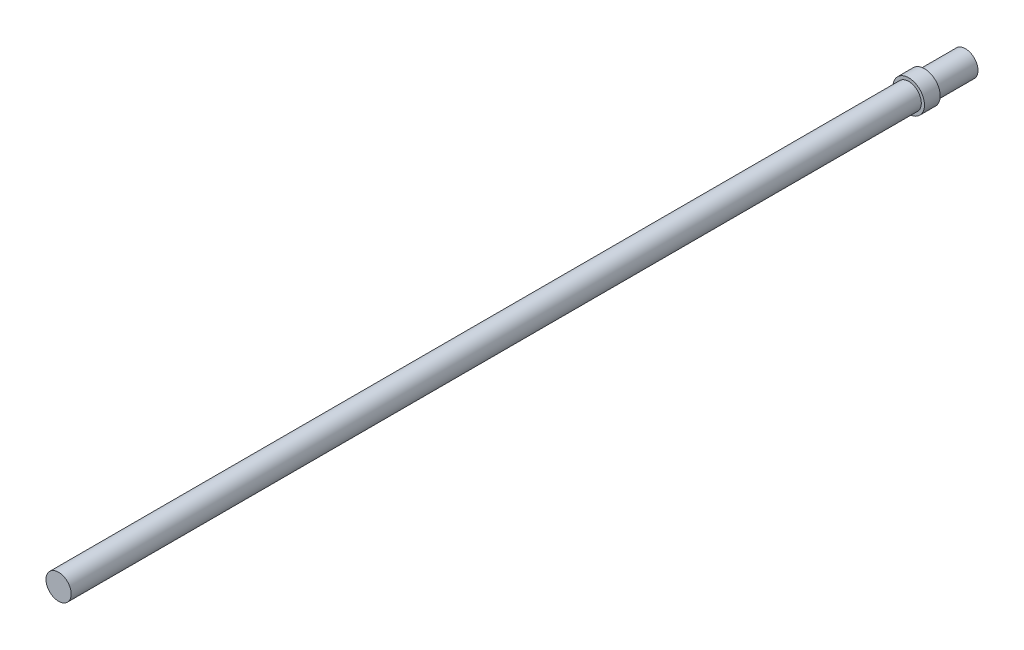
ISO-10303-21;
HEADER;
FILE_DESCRIPTION(('STEP AP214'),'2;1');
FILE_NAME('part.step','',(''),(''),'','','');
FILE_SCHEMA(('AUTOMOTIVE_DESIGN { 1 0 10303 214 1 1 1 1 }'));
ENDSEC;
DATA;
#1=APPLICATION_CONTEXT('core data for automotive mechanical design processes');
#2=APPLICATION_PROTOCOL_DEFINITION('international standard','automotive_design',2000,#1);
#3=PRODUCT_CONTEXT('',#1,'mechanical');
#4=PRODUCT('Part','Part','',(#3));
#5=PRODUCT_RELATED_PRODUCT_CATEGORY('part','',(#4));
#6=PRODUCT_DEFINITION_FORMATION('','',#4);
#7=PRODUCT_DEFINITION_CONTEXT('part definition',#1,'design');
#8=PRODUCT_DEFINITION('design','',#6,#7);
#9=PRODUCT_DEFINITION_SHAPE('','',#8);
#10=(LENGTH_UNIT() NAMED_UNIT(*) SI_UNIT(.MILLI.,.METRE.));
#11=(NAMED_UNIT(*) PLANE_ANGLE_UNIT() SI_UNIT($,.RADIAN.));
#12=(NAMED_UNIT(*) SI_UNIT($,.STERADIAN.) SOLID_ANGLE_UNIT());
#13=UNCERTAINTY_MEASURE_WITH_UNIT(LENGTH_MEASURE(1.E-05),#10,'distance_accuracy_value','');
#14=(GEOMETRIC_REPRESENTATION_CONTEXT(3) GLOBAL_UNCERTAINTY_ASSIGNED_CONTEXT((#13)) GLOBAL_UNIT_ASSIGNED_CONTEXT((#10,
#11,#12)) REPRESENTATION_CONTEXT('',''));
#15=CARTESIAN_POINT('',(0.,0.,0.));
#16=DIRECTION('',(0.,0.,1.));
#17=DIRECTION('',(1.,0.,0.));
#18=AXIS2_PLACEMENT_3D('',#15,#16,#17);
#19=CARTESIAN_POINT('',(0.,0.,270.));
#20=DIRECTION('',(0.,0.,-1.));
#21=DIRECTION('',(-1.,0.,0.));
#22=AXIS2_PLACEMENT_3D('',#19,#20,#21);
#23=CYLINDRICAL_SURFACE('',#22,4.);
#24=CARTESIAN_POINT('',(0.,0.,270.));
#25=DIRECTION('',(0.,0.,1.));
#26=DIRECTION('',(1.,0.,0.));
#27=AXIS2_PLACEMENT_3D('',#24,#25,#26);
#28=CIRCLE('',#27,4.);
#29=CARTESIAN_POINT('',(4.,0.,270.));
#30=VERTEX_POINT('',#29);
#31=EDGE_CURVE('E10',#30,#30,#28,.T.);
#32=ORIENTED_EDGE('',*,*,#31,.F.);
#33=EDGE_LOOP('',(#32));
#34=FACE_BOUND('',#33,.T.);
#35=CARTESIAN_POINT('',(0.,0.,0.));
#36=DIRECTION('',(0.,0.,1.));
#37=DIRECTION('',(1.,0.,0.));
#38=AXIS2_PLACEMENT_3D('',#35,#36,#37);
#39=CIRCLE('',#38,4.);
#40=CARTESIAN_POINT('',(4.,0.,0.));
#41=VERTEX_POINT('',#40);
#42=EDGE_CURVE('E37',#41,#41,#39,.T.);
#43=ORIENTED_EDGE('',*,*,#42,.T.);
#44=EDGE_LOOP('',(#43));
#45=FACE_BOUND('',#44,.T.);
#46=ADVANCED_FACE('F31',(#34,#45),#23,.T.);
#47=CARTESIAN_POINT('',(0.,0.,270.));
#48=DIRECTION('',(0.,0.,1.));
#49=DIRECTION('',(1.,0.,0.));
#50=AXIS2_PLACEMENT_3D('',#47,#48,#49);
#51=PLANE('',#50);
#52=ORIENTED_EDGE('',*,*,#31,.T.);
#53=EDGE_LOOP('',(#52));
#54=FACE_BOUND('',#53,.T.);
#55=ADVANCED_FACE('F69',(#54),#51,.T.);
#56=CARTESIAN_POINT('',(0.,0.,-5.));
#57=DIRECTION('',(0.,0.,1.));
#58=DIRECTION('',(1.,0.,0.));
#59=AXIS2_PLACEMENT_3D('',#56,#57,#58);
#60=CYLINDRICAL_SURFACE('',#59,5.);
#61=CARTESIAN_POINT('',(0.,0.,-5.));
#62=DIRECTION('',(0.,0.,1.));
#63=DIRECTION('',(1.,0.,0.));
#64=AXIS2_PLACEMENT_3D('',#61,#62,#63);
#65=CIRCLE('',#64,5.);
#66=CARTESIAN_POINT('',(5.,0.,-5.));
#67=VERTEX_POINT('',#66);
#68=EDGE_CURVE('E41',#67,#67,#65,.T.);
#69=ORIENTED_EDGE('',*,*,#68,.T.);
#70=EDGE_LOOP('',(#69));
#71=FACE_BOUND('',#70,.T.);
#72=CARTESIAN_POINT('',(0.,0.,0.));
#73=DIRECTION('',(0.,0.,1.));
#74=DIRECTION('',(1.,0.,0.));
#75=AXIS2_PLACEMENT_3D('',#72,#73,#74);
#76=CIRCLE('',#75,5.);
#77=CARTESIAN_POINT('',(5.,0.,0.));
#78=VERTEX_POINT('',#77);
#79=EDGE_CURVE('E45',#78,#78,#76,.T.);
#80=ORIENTED_EDGE('',*,*,#79,.F.);
#81=EDGE_LOOP('',(#80));
#82=FACE_BOUND('',#81,.T.);
#83=ADVANCED_FACE('F74',(#71,#82),#60,.T.);
#84=CARTESIAN_POINT('',(0.,0.,-5.));
#85=DIRECTION('',(0.,0.,1.));
#86=DIRECTION('',(1.,0.,0.));
#87=AXIS2_PLACEMENT_3D('',#84,#85,#86);
#88=PLANE('',#87);
#89=CARTESIAN_POINT('',(0.,0.,-5.));
#90=DIRECTION('',(0.,0.,1.));
#91=DIRECTION('',(1.,0.,0.));
#92=AXIS2_PLACEMENT_3D('',#89,#90,#91);
#93=CIRCLE('',#92,4.);
#94=CARTESIAN_POINT('',(4.,0.,-5.));
#95=VERTEX_POINT('',#94);
#96=EDGE_CURVE('E49',#95,#95,#93,.T.);
#97=ORIENTED_EDGE('',*,*,#96,.T.);
#98=EDGE_LOOP('',(#97));
#99=FACE_BOUND('',#98,.T.);
#100=ORIENTED_EDGE('',*,*,#68,.F.);
#101=EDGE_LOOP('',(#100));
#102=FACE_BOUND('',#101,.T.);
#103=ADVANCED_FACE('F78',(#99,#102),#88,.F.);
#104=CARTESIAN_POINT('',(0.,0.,0.));
#105=DIRECTION('',(0.,0.,1.));
#106=DIRECTION('',(1.,0.,0.));
#107=AXIS2_PLACEMENT_3D('',#104,#105,#106);
#108=PLANE('',#107);
#109=ORIENTED_EDGE('',*,*,#42,.F.);
#110=EDGE_LOOP('',(#109));
#111=FACE_BOUND('',#110,.T.);
#112=ORIENTED_EDGE('',*,*,#79,.T.);
#113=EDGE_LOOP('',(#112));
#114=FACE_BOUND('',#113,.T.);
#115=ADVANCED_FACE('F66',(#111,#114),#108,.T.);
#116=CARTESIAN_POINT('',(0.,0.,-18.));
#117=DIRECTION('',(0.,0.,1.));
#118=DIRECTION('',(1.,0.,0.));
#119=AXIS2_PLACEMENT_3D('',#116,#117,#118);
#120=CYLINDRICAL_SURFACE('',#119,4.);
#121=CARTESIAN_POINT('',(0.,0.,-18.));
#122=DIRECTION('',(0.,0.,1.));
#123=DIRECTION('',(1.,0.,0.));
#124=AXIS2_PLACEMENT_3D('',#121,#122,#123);
#125=CIRCLE('',#124,4.);
#126=CARTESIAN_POINT('',(4.,0.,-18.));
#127=VERTEX_POINT('',#126);
#128=EDGE_CURVE('E53',#127,#127,#125,.T.);
#129=ORIENTED_EDGE('',*,*,#128,.T.);
#130=EDGE_LOOP('',(#129));
#131=FACE_BOUND('',#130,.T.);
#132=ORIENTED_EDGE('',*,*,#96,.F.);
#133=EDGE_LOOP('',(#132));
#134=FACE_BOUND('',#133,.T.);
#135=ADVANCED_FACE('F57',(#131,#134),#120,.T.);
#136=CARTESIAN_POINT('',(0.,0.,-18.));
#137=DIRECTION('',(0.,0.,1.));
#138=DIRECTION('',(1.,0.,0.));
#139=AXIS2_PLACEMENT_3D('',#136,#137,#138);
#140=PLANE('',#139);
#141=ORIENTED_EDGE('',*,*,#128,.F.);
#142=EDGE_LOOP('',(#141));
#143=FACE_BOUND('',#142,.T.);
#144=ADVANCED_FACE('F60',(#143),#140,.F.);
#145=CLOSED_SHELL('',(#46,#55,#83,#103,#115,#135,#144));
#146=MANIFOLD_SOLID_BREP('B2',#145);
#147=ADVANCED_BREP_SHAPE_REPRESENTATION('',(#18,#146),#14);
#148=SHAPE_DEFINITION_REPRESENTATION(#9,#147);
ENDSEC;
END-ISO-10303-21;
